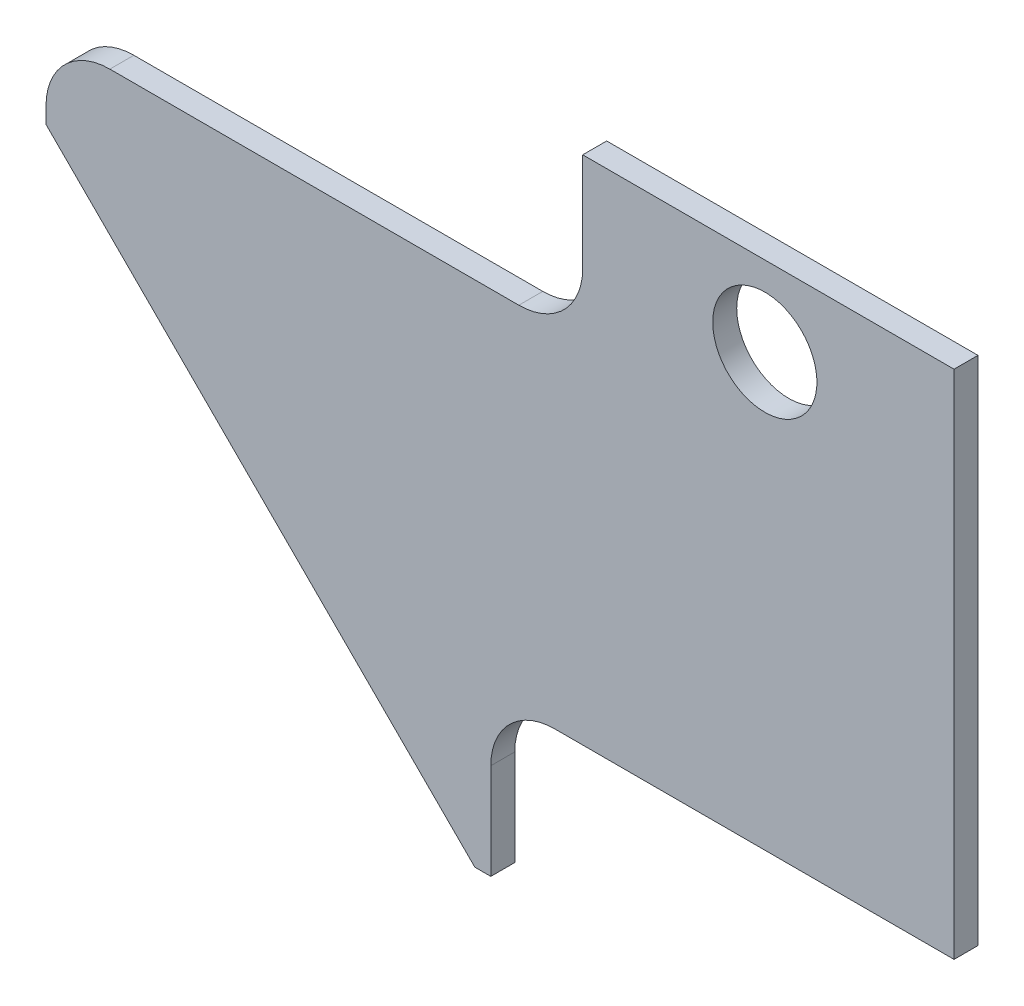
ISO-10303-21;
HEADER;
FILE_DESCRIPTION(('STEP AP214'),'2;1');
FILE_NAME('part.step','',(''),(''),'','','');
FILE_SCHEMA(('AUTOMOTIVE_DESIGN { 1 0 10303 214 1 1 1 1 }'));
ENDSEC;
DATA;
#1=APPLICATION_CONTEXT('core data for automotive mechanical design processes');
#2=APPLICATION_PROTOCOL_DEFINITION('international standard','automotive_design',2000,#1);
#3=PRODUCT_CONTEXT('',#1,'mechanical');
#4=PRODUCT('Part','Part','',(#3));
#5=PRODUCT_RELATED_PRODUCT_CATEGORY('part','',(#4));
#6=PRODUCT_DEFINITION_FORMATION('','',#4);
#7=PRODUCT_DEFINITION_CONTEXT('part definition',#1,'design');
#8=PRODUCT_DEFINITION('design','',#6,#7);
#9=PRODUCT_DEFINITION_SHAPE('','',#8);
#10=(LENGTH_UNIT() NAMED_UNIT(*) SI_UNIT(.MILLI.,.METRE.));
#11=(NAMED_UNIT(*) PLANE_ANGLE_UNIT() SI_UNIT($,.RADIAN.));
#12=(NAMED_UNIT(*) SI_UNIT($,.STERADIAN.) SOLID_ANGLE_UNIT());
#13=UNCERTAINTY_MEASURE_WITH_UNIT(LENGTH_MEASURE(1.E-05),#10,'distance_accuracy_value','');
#14=(GEOMETRIC_REPRESENTATION_CONTEXT(3) GLOBAL_UNCERTAINTY_ASSIGNED_CONTEXT((#13)) GLOBAL_UNIT_ASSIGNED_CONTEXT((#10,
#11,#12)) REPRESENTATION_CONTEXT('',''));
#15=CARTESIAN_POINT('',(0.,0.,0.));
#16=DIRECTION('',(0.,0.,1.));
#17=DIRECTION('',(1.,0.,0.));
#18=AXIS2_PLACEMENT_3D('',#15,#16,#17);
#19=CARTESIAN_POINT('',(0.,0.,9.525));
#20=DIRECTION('',(0.,0.,-1.));
#21=DIRECTION('',(-1.,0.,0.));
#22=AXIS2_PLACEMENT_3D('',#19,#20,#21);
#23=PLANE('',#22);
#24=DIRECTION('',(1.,0.,0.));
#25=VECTOR('',#24,1.);
#26=CARTESIAN_POINT('',(75.1006165261018,80.7414870213568,9.525));
#27=LINE('',#26,#25);
#28=CARTESIAN_POINT('',(-112.859383473898,80.7414870213568,9.525));
#29=VERTEX_POINT('',#28);
#30=CARTESIAN_POINT('',(49.7006165261019,80.7414870213568,9.525));
#31=VERTEX_POINT('',#30);
#32=EDGE_CURVE('E135',#29,#31,#27,.T.);
#33=ORIENTED_EDGE('',*,*,#32,.F.);
#34=CARTESIAN_POINT('',(-112.859383473898,55.3414870213568,9.525));
#35=DIRECTION('',(0.,0.,-1.));
#36=DIRECTION('',(-1.,0.,0.));
#37=AXIS2_PLACEMENT_3D('',#34,#35,#36);
#38=CIRCLE('',#37,25.4);
#39=CARTESIAN_POINT('',(-138.259383473898,55.3414870213567,9.525));
#40=VERTEX_POINT('',#39);
#41=EDGE_CURVE('E56',#29,#40,#38,.F.);
#42=ORIENTED_EDGE('',*,*,#41,.T.);
#43=DIRECTION('',(0.,-1.,0.));
#44=VECTOR('',#43,1.);
#45=CARTESIAN_POINT('',(-138.259383473898,145.221475743053,9.525));
#46=LINE('',#45,#44);
#47=CARTESIAN_POINT('',(-138.259383473898,48.9914870213568,9.525));
#48=VERTEX_POINT('',#47);
#49=EDGE_CURVE('E233',#40,#48,#46,.T.);
#50=ORIENTED_EDGE('',*,*,#49,.T.);
#51=DIRECTION('',(0.707106781186546,-0.707106781186549,0.));
#52=VECTOR('',#51,1.);
#53=CARTESIAN_POINT('',(-138.259383473898,48.9914870213568,9.525));
#54=LINE('',#53,#52);
#55=CARTESIAN_POINT('',(32.2106278044052,-121.478524256947,9.525));
#56=VERTEX_POINT('',#55);
#57=EDGE_CURVE('E235',#48,#56,#54,.T.);
#58=ORIENTED_EDGE('',*,*,#57,.T.);
#59=DIRECTION('',(1.,0.,0.));
#60=VECTOR('',#59,1.);
#61=CARTESIAN_POINT('',(32.2106278044052,-121.478524256947,9.525));
#62=LINE('',#61,#60);
#63=CARTESIAN_POINT('',(38.5606278044052,-121.478524256947,9.525));
#64=VERTEX_POINT('',#63);
#65=EDGE_CURVE('E168',#56,#64,#62,.T.);
#66=ORIENTED_EDGE('',*,*,#65,.T.);
#67=DIRECTION('',(0.,-1.,0.));
#68=VECTOR('',#67,1.);
#69=CARTESIAN_POINT('',(38.5606278044052,-121.478524256947,9.525));
#70=LINE('',#69,#68);
#71=CARTESIAN_POINT('',(38.5606278044052,-83.3785242569462,9.525));
#72=VERTEX_POINT('',#71);
#73=EDGE_CURVE('E198',#72,#64,#70,.T.);
#74=ORIENTED_EDGE('',*,*,#73,.F.);
#75=CARTESIAN_POINT('',(63.9606278044052,-83.3785242569462,9.525));
#76=DIRECTION('',(0.,0.,-1.));
#77=DIRECTION('',(-1.,0.,0.));
#78=AXIS2_PLACEMENT_3D('',#75,#76,#77);
#79=CIRCLE('',#78,25.4);
#80=CARTESIAN_POINT('',(63.9606278044055,-57.9785242569462,9.525));
#81=VERTEX_POINT('',#80);
#82=EDGE_CURVE('E41',#72,#81,#79,.T.);
#83=ORIENTED_EDGE('',*,*,#82,.T.);
#84=DIRECTION('',(-1.,0.,0.));
#85=VECTOR('',#84,1.);
#86=CARTESIAN_POINT('',(222.710627804405,-57.9785242569477,9.525));
#87=LINE('',#86,#85);
#88=CARTESIAN_POINT('',(222.710627804405,-57.9785242569477,9.525));
#89=VERTEX_POINT('',#88);
#90=EDGE_CURVE('E145',#89,#81,#87,.T.);
#91=ORIENTED_EDGE('',*,*,#90,.F.);
#92=DIRECTION('',(0.,1.,0.));
#93=VECTOR('',#92,1.);
#94=CARTESIAN_POINT('',(222.710627804405,-121.478524256948,9.525));
#95=LINE('',#94,#93);
#96=CARTESIAN_POINT('',(222.710627804405,145.221475743053,9.525));
#97=VERTEX_POINT('',#96);
#98=EDGE_CURVE('E163',#89,#97,#95,.T.);
#99=ORIENTED_EDGE('',*,*,#98,.T.);
#100=DIRECTION('',(-1.,0.,0.));
#101=VECTOR('',#100,1.);
#102=CARTESIAN_POINT('',(-138.259383473898,145.221475743053,9.525));
#103=LINE('',#102,#101);
#104=CARTESIAN_POINT('',(75.1006165261018,145.221475743053,9.525));
#105=VERTEX_POINT('',#104);
#106=EDGE_CURVE('E231',#97,#105,#103,.T.);
#107=ORIENTED_EDGE('',*,*,#106,.T.);
#108=DIRECTION('',(0.,1.,0.));
#109=VECTOR('',#108,1.);
#110=CARTESIAN_POINT('',(75.1006165261018,145.221475743053,9.525));
#111=LINE('',#110,#109);
#112=CARTESIAN_POINT('',(75.1006165261018,106.141487021357,9.525));
#113=VERTEX_POINT('',#112);
#114=EDGE_CURVE('E141',#113,#105,#111,.T.);
#115=ORIENTED_EDGE('',*,*,#114,.F.);
#116=CARTESIAN_POINT('',(49.7006165261019,106.141487021357,9.525));
#117=DIRECTION('',(0.,0.,-1.));
#118=DIRECTION('',(-1.,0.,0.));
#119=AXIS2_PLACEMENT_3D('',#116,#117,#118);
#120=CIRCLE('',#119,25.4);
#121=EDGE_CURVE('E177',#113,#31,#120,.T.);
#122=ORIENTED_EDGE('',*,*,#121,.T.);
#123=EDGE_LOOP('',(#33,#42,#50,#58,#66,#74,#83,#91,#99,#107,#115,#122));
#124=FACE_BOUND('',#123,.T.);
#125=CARTESIAN_POINT('',(147.490616526102,113.471475743053,9.525));
#126=DIRECTION('',(0.,0.,1.));
#127=DIRECTION('',(1.,0.,0.));
#128=AXIS2_PLACEMENT_3D('',#125,#126,#127);
#129=CIRCLE('',#128,20.701);
#130=CARTESIAN_POINT('',(126.789616526102,113.471475743053,9.525));
#131=VERTEX_POINT('',#130);
#132=EDGE_CURVE('E155',#131,#131,#129,.T.);
#133=ORIENTED_EDGE('',*,*,#132,.F.);
#134=EDGE_LOOP('',(#133));
#135=FACE_BOUND('',#134,.T.);
#136=ADVANCED_FACE('F33',(#124,#135),#23,.F.);
#137=CARTESIAN_POINT('',(0.,0.,0.));
#138=DIRECTION('',(0.,0.,-1.));
#139=DIRECTION('',(-1.,0.,0.));
#140=AXIS2_PLACEMENT_3D('',#137,#138,#139);
#141=PLANE('',#140);
#142=DIRECTION('',(0.,-1.,0.));
#143=VECTOR('',#142,1.);
#144=CARTESIAN_POINT('',(-138.259383473898,145.221475743053,0.));
#145=LINE('',#144,#143);
#146=CARTESIAN_POINT('',(-138.259383473898,55.3414870213567,0.));
#147=VERTEX_POINT('',#146);
#148=CARTESIAN_POINT('',(-138.259383473898,48.9914870213568,0.));
#149=VERTEX_POINT('',#148);
#150=EDGE_CURVE('E150',#147,#149,#145,.T.);
#151=ORIENTED_EDGE('',*,*,#150,.F.);
#152=CARTESIAN_POINT('',(-112.859383473898,55.3414870213568,0.));
#153=DIRECTION('',(0.,0.,-1.));
#154=DIRECTION('',(-1.,0.,0.));
#155=AXIS2_PLACEMENT_3D('',#152,#153,#154);
#156=CIRCLE('',#155,25.4);
#157=CARTESIAN_POINT('',(-112.859383473898,80.7414870213568,0.));
#158=VERTEX_POINT('',#157);
#159=EDGE_CURVE('E191',#147,#158,#156,.T.);
#160=ORIENTED_EDGE('',*,*,#159,.T.);
#161=DIRECTION('',(1.,0.,0.));
#162=VECTOR('',#161,1.);
#163=CARTESIAN_POINT('',(75.1006165261018,80.7414870213568,0.));
#164=LINE('',#163,#162);
#165=CARTESIAN_POINT('',(49.7006165261019,80.7414870213568,0.));
#166=VERTEX_POINT('',#165);
#167=EDGE_CURVE('E134',#158,#166,#164,.T.);
#168=ORIENTED_EDGE('',*,*,#167,.T.);
#169=CARTESIAN_POINT('',(49.7006165261019,106.141487021357,0.));
#170=DIRECTION('',(0.,0.,-1.));
#171=DIRECTION('',(-1.,0.,0.));
#172=AXIS2_PLACEMENT_3D('',#169,#170,#171);
#173=CIRCLE('',#172,25.4);
#174=CARTESIAN_POINT('',(75.1006165261018,106.141487021357,0.));
#175=VERTEX_POINT('',#174);
#176=EDGE_CURVE('E130',#166,#175,#173,.F.);
#177=ORIENTED_EDGE('',*,*,#176,.T.);
#178=DIRECTION('',(0.,1.,0.));
#179=VECTOR('',#178,1.);
#180=CARTESIAN_POINT('',(75.1006165261018,145.221475743053,0.));
#181=LINE('',#180,#179);
#182=CARTESIAN_POINT('',(75.1006165261018,145.221475743053,0.));
#183=VERTEX_POINT('',#182);
#184=EDGE_CURVE('E121',#175,#183,#181,.T.);
#185=ORIENTED_EDGE('',*,*,#184,.T.);
#186=DIRECTION('',(-1.,0.,0.));
#187=VECTOR('',#186,1.);
#188=CARTESIAN_POINT('',(-138.259383473898,145.221475743053,0.));
#189=LINE('',#188,#187);
#190=CARTESIAN_POINT('',(222.710627804405,145.221475743053,0.));
#191=VERTEX_POINT('',#190);
#192=EDGE_CURVE('E127',#191,#183,#189,.T.);
#193=ORIENTED_EDGE('',*,*,#192,.F.);
#194=DIRECTION('',(0.,1.,0.));
#195=VECTOR('',#194,1.);
#196=CARTESIAN_POINT('',(222.710627804405,-121.478524256948,0.));
#197=LINE('',#196,#195);
#198=CARTESIAN_POINT('',(222.710627804405,-57.9785242569477,0.));
#199=VERTEX_POINT('',#198);
#200=EDGE_CURVE('E151',#199,#191,#197,.T.);
#201=ORIENTED_EDGE('',*,*,#200,.F.);
#202=DIRECTION('',(-1.,0.,0.));
#203=VECTOR('',#202,1.);
#204=CARTESIAN_POINT('',(222.710627804405,-57.9785242569477,0.));
#205=LINE('',#204,#203);
#206=CARTESIAN_POINT('',(63.9606278044055,-57.9785242569462,0.));
#207=VERTEX_POINT('',#206);
#208=EDGE_CURVE('E214',#199,#207,#205,.T.);
#209=ORIENTED_EDGE('',*,*,#208,.T.);
#210=CARTESIAN_POINT('',(63.9606278044052,-83.3785242569462,0.));
#211=DIRECTION('',(0.,0.,-1.));
#212=DIRECTION('',(-1.,0.,0.));
#213=AXIS2_PLACEMENT_3D('',#210,#211,#212);
#214=CIRCLE('',#213,25.4);
#215=CARTESIAN_POINT('',(38.5606278044052,-83.3785242569462,0.));
#216=VERTEX_POINT('',#215);
#217=EDGE_CURVE('E11',#207,#216,#214,.F.);
#218=ORIENTED_EDGE('',*,*,#217,.T.);
#219=DIRECTION('',(0.,-1.,0.));
#220=VECTOR('',#219,1.);
#221=CARTESIAN_POINT('',(38.5606278044052,-121.478524256947,0.));
#222=LINE('',#221,#220);
#223=CARTESIAN_POINT('',(38.5606278044052,-121.478524256947,0.));
#224=VERTEX_POINT('',#223);
#225=EDGE_CURVE('E212',#216,#224,#222,.T.);
#226=ORIENTED_EDGE('',*,*,#225,.T.);
#227=DIRECTION('',(1.,0.,0.));
#228=VECTOR('',#227,1.);
#229=CARTESIAN_POINT('',(32.2106278044052,-121.478524256947,0.));
#230=LINE('',#229,#228);
#231=CARTESIAN_POINT('',(32.2106278044052,-121.478524256947,0.));
#232=VERTEX_POINT('',#231);
#233=EDGE_CURVE('E160',#232,#224,#230,.T.);
#234=ORIENTED_EDGE('',*,*,#233,.F.);
#235=DIRECTION('',(0.707106781186546,-0.707106781186549,0.));
#236=VECTOR('',#235,1.);
#237=CARTESIAN_POINT('',(-138.259383473898,48.9914870213568,0.));
#238=LINE('',#237,#236);
#239=EDGE_CURVE('E153',#149,#232,#238,.T.);
#240=ORIENTED_EDGE('',*,*,#239,.F.);
#241=EDGE_LOOP('',(#151,#160,#168,#177,#185,#193,#201,#209,#218,#226,#234,#240));
#242=FACE_BOUND('',#241,.T.);
#243=CARTESIAN_POINT('',(147.490616526102,113.471475743053,0.));
#244=DIRECTION('',(0.,0.,1.));
#245=DIRECTION('',(1.,0.,0.));
#246=AXIS2_PLACEMENT_3D('',#243,#244,#245);
#247=CIRCLE('',#246,20.701);
#248=CARTESIAN_POINT('',(126.789616526102,113.471475743053,0.));
#249=VERTEX_POINT('',#248);
#250=EDGE_CURVE('E224',#249,#249,#247,.T.);
#251=ORIENTED_EDGE('',*,*,#250,.T.);
#252=EDGE_LOOP('',(#251));
#253=FACE_BOUND('',#252,.T.);
#254=ADVANCED_FACE('F123',(#242,#253),#141,.T.);
#255=CARTESIAN_POINT('',(222.710627804405,-121.478524256948,9.525));
#256=DIRECTION('',(-1.,0.,0.));
#257=DIRECTION('',(0.,-1.,0.));
#258=AXIS2_PLACEMENT_3D('',#255,#256,#257);
#259=PLANE('',#258);
#260=ORIENTED_EDGE('',*,*,#98,.F.);
#261=DIRECTION('',(0.,0.,1.));
#262=VECTOR('',#261,1.);
#263=CARTESIAN_POINT('',(222.710627804405,-57.9785242569477,0.));
#264=LINE('',#263,#262);
#265=EDGE_CURVE('E206',#199,#89,#264,.T.);
#266=ORIENTED_EDGE('',*,*,#265,.F.);
#267=ORIENTED_EDGE('',*,*,#200,.T.);
#268=DIRECTION('',(0.,0.,-1.));
#269=VECTOR('',#268,1.);
#270=CARTESIAN_POINT('',(222.710627804405,145.221475743053,9.525));
#271=LINE('',#270,#269);
#272=EDGE_CURVE('E149',#97,#191,#271,.T.);
#273=ORIENTED_EDGE('',*,*,#272,.F.);
#274=EDGE_LOOP('',(#260,#266,#267,#273));
#275=FACE_BOUND('',#274,.T.);
#276=ADVANCED_FACE('F271',(#275),#259,.F.);
#277=CARTESIAN_POINT('',(-138.259383473898,145.221475743053,9.525));
#278=DIRECTION('',(0.,-1.,0.));
#279=DIRECTION('',(0.,0.,-1.));
#280=AXIS2_PLACEMENT_3D('',#277,#278,#279);
#281=PLANE('',#280);
#282=ORIENTED_EDGE('',*,*,#192,.T.);
#283=DIRECTION('',(0.,0.,1.));
#284=VECTOR('',#283,1.);
#285=CARTESIAN_POINT('',(75.1006165261018,145.221475743053,0.));
#286=LINE('',#285,#284);
#287=EDGE_CURVE('E138',#183,#105,#286,.T.);
#288=ORIENTED_EDGE('',*,*,#287,.T.);
#289=ORIENTED_EDGE('',*,*,#106,.F.);
#290=ORIENTED_EDGE('',*,*,#272,.T.);
#291=EDGE_LOOP('',(#282,#288,#289,#290));
#292=FACE_BOUND('',#291,.T.);
#293=ADVANCED_FACE('F147',(#292),#281,.F.);
#294=CARTESIAN_POINT('',(-138.259383473898,145.221475743053,9.525));
#295=DIRECTION('',(1.,0.,0.));
#296=DIRECTION('',(0.,1.,0.));
#297=AXIS2_PLACEMENT_3D('',#294,#295,#296);
#298=PLANE('',#297);
#299=ORIENTED_EDGE('',*,*,#49,.F.);
#300=DIRECTION('',(0.,0.,1.));
#301=VECTOR('',#300,1.);
#302=CARTESIAN_POINT('',(-138.259383473898,55.3414870213567,9.525));
#303=LINE('',#302,#301);
#304=EDGE_CURVE('E48',#40,#147,#303,.F.);
#305=ORIENTED_EDGE('',*,*,#304,.T.);
#306=ORIENTED_EDGE('',*,*,#150,.T.);
#307=DIRECTION('',(0.,0.,-1.));
#308=VECTOR('',#307,1.);
#309=CARTESIAN_POINT('',(-138.259383473898,48.9914870213568,9.525));
#310=LINE('',#309,#308);
#311=EDGE_CURVE('E167',#48,#149,#310,.T.);
#312=ORIENTED_EDGE('',*,*,#311,.F.);
#313=EDGE_LOOP('',(#299,#305,#306,#312));
#314=FACE_BOUND('',#313,.T.);
#315=ADVANCED_FACE('F246',(#314),#298,.F.);
#316=CARTESIAN_POINT('',(-138.259383473898,48.9914870213568,9.525));
#317=DIRECTION('',(0.707106781186549,0.707106781186546,0.));
#318=DIRECTION('',(-0.707106781186546,0.707106781186549,0.));
#319=AXIS2_PLACEMENT_3D('',#316,#317,#318);
#320=PLANE('',#319);
#321=ORIENTED_EDGE('',*,*,#239,.T.);
#322=DIRECTION('',(0.,0.,-1.));
#323=VECTOR('',#322,1.);
#324=CARTESIAN_POINT('',(32.2106278044052,-121.478524256947,9.525));
#325=LINE('',#324,#323);
#326=EDGE_CURVE('E164',#56,#232,#325,.T.);
#327=ORIENTED_EDGE('',*,*,#326,.F.);
#328=ORIENTED_EDGE('',*,*,#57,.F.);
#329=ORIENTED_EDGE('',*,*,#311,.T.);
#330=EDGE_LOOP('',(#321,#327,#328,#329));
#331=FACE_BOUND('',#330,.T.);
#332=ADVANCED_FACE('F244',(#331),#320,.F.);
#333=CARTESIAN_POINT('',(32.2106278044052,-121.478524256947,9.525));
#334=DIRECTION('',(0.,1.,0.));
#335=DIRECTION('',(-1.,0.,0.));
#336=AXIS2_PLACEMENT_3D('',#333,#334,#335);
#337=PLANE('',#336);
#338=ORIENTED_EDGE('',*,*,#233,.T.);
#339=DIRECTION('',(0.,0.,1.));
#340=VECTOR('',#339,1.);
#341=CARTESIAN_POINT('',(38.5606278044052,-121.478524256947,0.));
#342=LINE('',#341,#340);
#343=EDGE_CURVE('E218',#224,#64,#342,.T.);
#344=ORIENTED_EDGE('',*,*,#343,.T.);
#345=ORIENTED_EDGE('',*,*,#65,.F.);
#346=ORIENTED_EDGE('',*,*,#326,.T.);
#347=EDGE_LOOP('',(#338,#344,#345,#346));
#348=FACE_BOUND('',#347,.T.);
#349=ADVANCED_FACE('F240',(#348),#337,.F.);
#350=CARTESIAN_POINT('',(147.490616526102,113.471475743053,9.525));
#351=DIRECTION('',(0.,0.,-1.));
#352=DIRECTION('',(-1.,0.,0.));
#353=AXIS2_PLACEMENT_3D('',#350,#351,#352);
#354=CYLINDRICAL_SURFACE('',#353,20.701);
#355=CARTESIAN_POINT('',(126.789616526102,113.471475743053,9.525));
#356=CARTESIAN_POINT('',(126.789616526102,113.471475743053,9.42578125));
#357=CARTESIAN_POINT('',(126.789616526102,113.471475743053,9.3265625));
#358=CARTESIAN_POINT('',(126.789616526102,113.471475743053,9.128125));
#359=CARTESIAN_POINT('',(126.789616526102,113.471475743053,9.02890625));
#360=CARTESIAN_POINT('',(126.789616526102,113.471475743053,8.83046875));
#361=CARTESIAN_POINT('',(126.789616526102,113.471475743053,8.73125));
#362=CARTESIAN_POINT('',(126.789616526102,113.471475743053,8.5328125));
#363=CARTESIAN_POINT('',(126.789616526102,113.471475743053,8.43359375));
#364=CARTESIAN_POINT('',(126.789616526102,113.471475743053,8.23515625));
#365=CARTESIAN_POINT('',(126.789616526102,113.471475743053,8.1359375));
#366=CARTESIAN_POINT('',(126.789616526102,113.471475743053,7.9375));
#367=CARTESIAN_POINT('',(126.789616526102,113.471475743053,7.83828125));
#368=CARTESIAN_POINT('',(126.789616526102,113.471475743053,7.63984375));
#369=CARTESIAN_POINT('',(126.789616526102,113.471475743053,7.540625));
#370=CARTESIAN_POINT('',(126.789616526102,113.471475743053,7.3421875));
#371=CARTESIAN_POINT('',(126.789616526102,113.471475743053,7.24296875));
#372=CARTESIAN_POINT('',(126.789616526102,113.471475743053,7.04453125));
#373=CARTESIAN_POINT('',(126.789616526102,113.471475743053,6.9453125));
#374=CARTESIAN_POINT('',(126.789616526102,113.471475743053,6.746875));
#375=CARTESIAN_POINT('',(126.789616526102,113.471475743053,6.64765625));
#376=CARTESIAN_POINT('',(126.789616526102,113.471475743053,6.44921875));
#377=CARTESIAN_POINT('',(126.789616526102,113.471475743053,6.35));
#378=CARTESIAN_POINT('',(126.789616526102,113.471475743053,6.1515625));
#379=CARTESIAN_POINT('',(126.789616526102,113.471475743053,6.05234375));
#380=CARTESIAN_POINT('',(126.789616526102,113.471475743053,5.85390625));
#381=CARTESIAN_POINT('',(126.789616526102,113.471475743053,5.7546875));
#382=CARTESIAN_POINT('',(126.789616526102,113.471475743053,5.55625));
#383=CARTESIAN_POINT('',(126.789616526102,113.471475743053,5.45703125));
#384=CARTESIAN_POINT('',(126.789616526102,113.471475743053,5.25859375));
#385=CARTESIAN_POINT('',(126.789616526102,113.471475743053,5.159375));
#386=CARTESIAN_POINT('',(126.789616526102,113.471475743053,4.9609375));
#387=CARTESIAN_POINT('',(126.789616526102,113.471475743053,4.86171875));
#388=CARTESIAN_POINT('',(126.789616526102,113.471475743053,4.66328125));
#389=CARTESIAN_POINT('',(126.789616526102,113.471475743053,4.5640625));
#390=CARTESIAN_POINT('',(126.789616526102,113.471475743053,4.365625));
#391=CARTESIAN_POINT('',(126.789616526102,113.471475743053,4.26640625));
#392=CARTESIAN_POINT('',(126.789616526102,113.471475743053,4.06796875));
#393=CARTESIAN_POINT('',(126.789616526102,113.471475743053,3.96875));
#394=CARTESIAN_POINT('',(126.789616526102,113.471475743053,3.7703125));
#395=CARTESIAN_POINT('',(126.789616526102,113.471475743053,3.67109375));
#396=CARTESIAN_POINT('',(126.789616526102,113.471475743053,3.47265625));
#397=CARTESIAN_POINT('',(126.789616526102,113.471475743053,3.3734375));
#398=CARTESIAN_POINT('',(126.789616526102,113.471475743053,3.175));
#399=CARTESIAN_POINT('',(126.789616526102,113.471475743053,3.07578125));
#400=CARTESIAN_POINT('',(126.789616526102,113.471475743053,2.87734375));
#401=CARTESIAN_POINT('',(126.789616526102,113.471475743053,2.778125));
#402=CARTESIAN_POINT('',(126.789616526102,113.471475743053,2.5796875));
#403=CARTESIAN_POINT('',(126.789616526102,113.471475743053,2.48046875));
#404=CARTESIAN_POINT('',(126.789616526102,113.471475743053,2.28203125));
#405=CARTESIAN_POINT('',(126.789616526102,113.471475743053,2.1828125));
#406=CARTESIAN_POINT('',(126.789616526102,113.471475743053,1.984375));
#407=CARTESIAN_POINT('',(126.789616526102,113.471475743053,1.88515625));
#408=CARTESIAN_POINT('',(126.789616526102,113.471475743053,1.68671875));
#409=CARTESIAN_POINT('',(126.789616526102,113.471475743053,1.5875));
#410=CARTESIAN_POINT('',(126.789616526102,113.471475743053,1.3890625));
#411=CARTESIAN_POINT('',(126.789616526102,113.471475743053,1.28984375));
#412=CARTESIAN_POINT('',(126.789616526102,113.471475743053,1.09140625));
#413=CARTESIAN_POINT('',(126.789616526102,113.471475743053,0.992187500000001));
#414=CARTESIAN_POINT('',(126.789616526102,113.471475743053,0.793750000000001));
#415=CARTESIAN_POINT('',(126.789616526102,113.471475743053,0.69453125));
#416=CARTESIAN_POINT('',(126.789616526102,113.471475743053,0.49609375));
#417=CARTESIAN_POINT('',(126.789616526102,113.471475743053,0.396875));
#418=CARTESIAN_POINT('',(126.789616526102,113.471475743053,0.1984375));
#419=CARTESIAN_POINT('',(126.789616526102,113.471475743053,0.0992187500000001));
#420=CARTESIAN_POINT('',(126.789616526102,113.471475743053,0.));
#421=B_SPLINE_CURVE_WITH_KNOTS('',3,(#355,#356,#357,#358,#359,#360,#361,#362,#363,#364,#365,
#366,#367,#368,#369,#370,#371,#372,#373,#374,#375,#376,#377,#378,#379,#380,#381,#382,#383,#384,
#385,#386,#387,#388,#389,#390,#391,#392,#393,#394,#395,#396,#397,#398,#399,#400,#401,#402,#403,
#404,#405,#406,#407,#408,#409,#410,#411,#412,#413,#414,#415,#416,#417,#418,#419,#420),
.UNSPECIFIED.,.F.,.F.,(4,2,2,2,2,2,2,2,2,2,2,2,2,2,2,2,2,2,2,2,2,2,2,2,2,2,2,2,2,2,2,2,4),(0.,
0.29765625,0.5953125,0.892968750000001,1.190625,1.48828125,1.7859375,2.08359375,2.38125,
2.67890625,2.9765625,3.27421875,3.571875,3.86953125,4.1671875,4.46484375,4.7625,5.06015625,
5.3578125,5.65546875,5.953125,6.25078125,6.5484375,6.84609375,7.14375,7.44140625,7.7390625,
8.03671875,8.334375,8.63203125,8.9296875,9.22734375,9.525),.UNSPECIFIED.);
#422=EDGE_CURVE('BSEAM274',#131,#249,#421,.T.);
#423=ORIENTED_EDGE('',*,*,#132,.T.);
#424=ORIENTED_EDGE('',*,*,#250,.F.);
#425=ORIENTED_EDGE('',*,*,#422,.T.);
#426=ORIENTED_EDGE('',*,*,#422,.F.);
#427=EDGE_LOOP('',(#423,#425,#424,#426));
#428=FACE_BOUND('',#427,.T.);
#429=ADVANCED_FACE('F274',(#428),#354,.F.);
#430=CARTESIAN_POINT('',(38.5606278044052,-121.478524256947,0.));
#431=DIRECTION('',(-1.,0.,0.));
#432=DIRECTION('',(0.,0.,1.));
#433=AXIS2_PLACEMENT_3D('',#430,#431,#432);
#434=PLANE('',#433);
#435=ORIENTED_EDGE('',*,*,#225,.F.);
#436=DIRECTION('',(0.,0.,1.));
#437=VECTOR('',#436,1.);
#438=CARTESIAN_POINT('',(38.5606278044052,-83.3785242569462,9.525));
#439=LINE('',#438,#437);
#440=EDGE_CURVE('E181',#216,#72,#439,.T.);
#441=ORIENTED_EDGE('',*,*,#440,.T.);
#442=ORIENTED_EDGE('',*,*,#73,.T.);
#443=ORIENTED_EDGE('',*,*,#343,.F.);
#444=EDGE_LOOP('',(#435,#441,#442,#443));
#445=FACE_BOUND('',#444,.T.);
#446=ADVANCED_FACE('F216',(#445),#434,.F.);
#447=CARTESIAN_POINT('',(222.710627804405,-57.9785242569477,0.));
#448=DIRECTION('',(0.,1.,0.));
#449=DIRECTION('',(-1.,0.,0.));
#450=AXIS2_PLACEMENT_3D('',#447,#448,#449);
#451=PLANE('',#450);
#452=ORIENTED_EDGE('',*,*,#90,.T.);
#453=DIRECTION('',(0.,0.,1.));
#454=VECTOR('',#453,1.);
#455=CARTESIAN_POINT('',(63.9606278044055,-57.9785242569462,0.));
#456=LINE('',#455,#454);
#457=EDGE_CURVE('E184',#81,#207,#456,.F.);
#458=ORIENTED_EDGE('',*,*,#457,.T.);
#459=ORIENTED_EDGE('',*,*,#208,.F.);
#460=ORIENTED_EDGE('',*,*,#265,.T.);
#461=EDGE_LOOP('',(#452,#458,#459,#460));
#462=FACE_BOUND('',#461,.T.);
#463=ADVANCED_FACE('F203',(#462),#451,.F.);
#464=CARTESIAN_POINT('',(75.1006165261018,145.221475743053,0.));
#465=DIRECTION('',(1.,0.,0.));
#466=DIRECTION('',(0.,1.,0.));
#467=AXIS2_PLACEMENT_3D('',#464,#465,#466);
#468=PLANE('',#467);
#469=ORIENTED_EDGE('',*,*,#184,.F.);
#470=DIRECTION('',(0.,0.,1.));
#471=VECTOR('',#470,1.);
#472=CARTESIAN_POINT('',(75.1006165261018,106.141487021357,9.525));
#473=LINE('',#472,#471);
#474=EDGE_CURVE('E172',#175,#113,#473,.T.);
#475=ORIENTED_EDGE('',*,*,#474,.T.);
#476=ORIENTED_EDGE('',*,*,#114,.T.);
#477=ORIENTED_EDGE('',*,*,#287,.F.);
#478=EDGE_LOOP('',(#469,#475,#476,#477));
#479=FACE_BOUND('',#478,.T.);
#480=ADVANCED_FACE('F139',(#479),#468,.F.);
#481=CARTESIAN_POINT('',(75.1006165261018,80.7414870213568,0.));
#482=DIRECTION('',(0.,-1.,0.));
#483=DIRECTION('',(1.,0.,0.));
#484=AXIS2_PLACEMENT_3D('',#481,#482,#483);
#485=PLANE('',#484);
#486=ORIENTED_EDGE('',*,*,#167,.F.);
#487=DIRECTION('',(0.,0.,1.));
#488=VECTOR('',#487,1.);
#489=CARTESIAN_POINT('',(-112.859383473898,80.7414870213568,0.));
#490=LINE('',#489,#488);
#491=EDGE_CURVE('E186',#158,#29,#490,.T.);
#492=ORIENTED_EDGE('',*,*,#491,.T.);
#493=ORIENTED_EDGE('',*,*,#32,.T.);
#494=DIRECTION('',(0.,0.,1.));
#495=VECTOR('',#494,1.);
#496=CARTESIAN_POINT('',(49.7006165261019,80.7414870213568,0.));
#497=LINE('',#496,#495);
#498=EDGE_CURVE('E174',#31,#166,#497,.F.);
#499=ORIENTED_EDGE('',*,*,#498,.T.);
#500=EDGE_LOOP('',(#486,#492,#493,#499));
#501=FACE_BOUND('',#500,.T.);
#502=ADVANCED_FACE('F251',(#501),#485,.F.);
#503=CARTESIAN_POINT('',(49.7006165261019,106.141487021357,0.));
#504=DIRECTION('',(0.,0.,-1.));
#505=DIRECTION('',(-1.,0.,0.));
#506=AXIS2_PLACEMENT_3D('',#503,#504,#505);
#507=CYLINDRICAL_SURFACE('',#506,25.4);
#508=ORIENTED_EDGE('',*,*,#176,.F.);
#509=ORIENTED_EDGE('',*,*,#498,.F.);
#510=ORIENTED_EDGE('',*,*,#121,.F.);
#511=ORIENTED_EDGE('',*,*,#474,.F.);
#512=EDGE_LOOP('',(#508,#509,#510,#511));
#513=FACE_BOUND('',#512,.T.);
#514=ADVANCED_FACE('F257',(#513),#507,.F.);
#515=CARTESIAN_POINT('',(63.9606278044052,-83.3785242569462,0.));
#516=DIRECTION('',(0.,0.,-1.));
#517=DIRECTION('',(-1.,0.,0.));
#518=AXIS2_PLACEMENT_3D('',#515,#516,#517);
#519=CYLINDRICAL_SURFACE('',#518,25.4);
#520=ORIENTED_EDGE('',*,*,#217,.F.);
#521=ORIENTED_EDGE('',*,*,#457,.F.);
#522=ORIENTED_EDGE('',*,*,#82,.F.);
#523=ORIENTED_EDGE('',*,*,#440,.F.);
#524=EDGE_LOOP('',(#520,#521,#522,#523));
#525=FACE_BOUND('',#524,.T.);
#526=ADVANCED_FACE('F209',(#525),#519,.F.);
#527=CARTESIAN_POINT('',(-112.859383473898,55.3414870213568,0.));
#528=DIRECTION('',(0.,0.,1.));
#529=DIRECTION('',(1.,0.,0.));
#530=AXIS2_PLACEMENT_3D('',#527,#528,#529);
#531=CYLINDRICAL_SURFACE('',#530,25.4);
#532=ORIENTED_EDGE('',*,*,#159,.F.);
#533=ORIENTED_EDGE('',*,*,#304,.F.);
#534=ORIENTED_EDGE('',*,*,#41,.F.);
#535=ORIENTED_EDGE('',*,*,#491,.F.);
#536=EDGE_LOOP('',(#532,#533,#534,#535));
#537=FACE_BOUND('',#536,.T.);
#538=ADVANCED_FACE('F35',(#537),#531,.T.);
#539=CLOSED_SHELL('',(#136,#254,#276,#293,#315,#332,#349,#429,#446,#463,#480,#502,#514,#526,#538));
#540=MANIFOLD_SOLID_BREP('B2',#539);
#541=ADVANCED_BREP_SHAPE_REPRESENTATION('',(#18,#540),#14);
#542=SHAPE_DEFINITION_REPRESENTATION(#9,#541);
ENDSEC;
END-ISO-10303-21;
